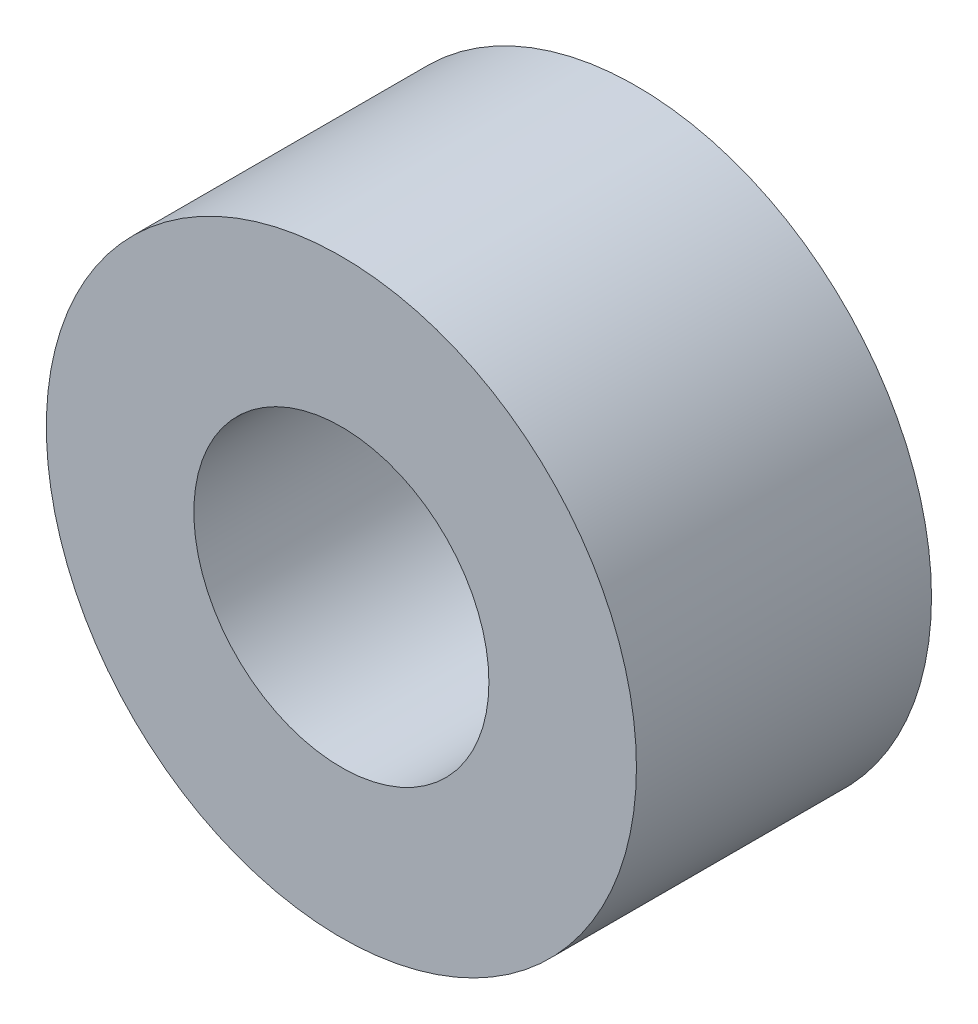
ISO-10303-21;
HEADER;
FILE_DESCRIPTION(('STEP AP214'),'2;1');
FILE_NAME('part.step','',(''),(''),'','','');
FILE_SCHEMA(('AUTOMOTIVE_DESIGN { 1 0 10303 214 1 1 1 1 }'));
ENDSEC;
DATA;
#1=APPLICATION_CONTEXT('core data for automotive mechanical design processes');
#2=APPLICATION_PROTOCOL_DEFINITION('international standard','automotive_design',2000,#1);
#3=PRODUCT_CONTEXT('',#1,'mechanical');
#4=PRODUCT('Part','Part','',(#3));
#5=PRODUCT_RELATED_PRODUCT_CATEGORY('part','',(#4));
#6=PRODUCT_DEFINITION_FORMATION('','',#4);
#7=PRODUCT_DEFINITION_CONTEXT('part definition',#1,'design');
#8=PRODUCT_DEFINITION('design','',#6,#7);
#9=PRODUCT_DEFINITION_SHAPE('','',#8);
#10=(LENGTH_UNIT() NAMED_UNIT(*) SI_UNIT(.MILLI.,.METRE.));
#11=(NAMED_UNIT(*) PLANE_ANGLE_UNIT() SI_UNIT($,.RADIAN.));
#12=(NAMED_UNIT(*) SI_UNIT($,.STERADIAN.) SOLID_ANGLE_UNIT());
#13=UNCERTAINTY_MEASURE_WITH_UNIT(LENGTH_MEASURE(1.E-05),#10,'distance_accuracy_value','');
#14=(GEOMETRIC_REPRESENTATION_CONTEXT(3) GLOBAL_UNCERTAINTY_ASSIGNED_CONTEXT((#13)) GLOBAL_UNIT_ASSIGNED_CONTEXT((#10,
#11,#12)) REPRESENTATION_CONTEXT('',''));
#15=CARTESIAN_POINT('',(0.,0.,0.));
#16=DIRECTION('',(0.,0.,1.));
#17=DIRECTION('',(1.,0.,0.));
#18=AXIS2_PLACEMENT_3D('',#15,#16,#17);
#19=CARTESIAN_POINT('',(0.,0.,6.));
#20=DIRECTION('',(0.,0.,1.));
#21=DIRECTION('',(1.,0.,0.));
#22=AXIS2_PLACEMENT_3D('',#19,#20,#21);
#23=PLANE('',#22);
#24=CARTESIAN_POINT('',(0.,0.,6.));
#25=DIRECTION('',(0.,0.,1.));
#26=DIRECTION('',(1.,0.,0.));
#27=AXIS2_PLACEMENT_3D('',#24,#25,#26);
#28=CIRCLE('',#27,6.);
#29=CARTESIAN_POINT('',(6.,0.,6.));
#30=VERTEX_POINT('',#29);
#31=EDGE_CURVE('E10',#30,#30,#28,.T.);
#32=ORIENTED_EDGE('',*,*,#31,.T.);
#33=EDGE_LOOP('',(#32));
#34=FACE_BOUND('',#33,.T.);
#35=CARTESIAN_POINT('',(0.,0.,6.));
#36=DIRECTION('',(0.,0.,1.));
#37=DIRECTION('',(1.,0.,0.));
#38=AXIS2_PLACEMENT_3D('',#35,#36,#37);
#39=CIRCLE('',#38,3.);
#40=CARTESIAN_POINT('',(3.,0.,6.));
#41=VERTEX_POINT('',#40);
#42=EDGE_CURVE('E43',#41,#41,#39,.T.);
#43=ORIENTED_EDGE('',*,*,#42,.F.);
#44=EDGE_LOOP('',(#43));
#45=FACE_BOUND('',#44,.T.);
#46=ADVANCED_FACE('F32',(#34,#45),#23,.T.);
#47=CARTESIAN_POINT('',(0.,0.,0.));
#48=DIRECTION('',(0.,0.,1.));
#49=DIRECTION('',(1.,0.,0.));
#50=AXIS2_PLACEMENT_3D('',#47,#48,#49);
#51=PLANE('',#50);
#52=CARTESIAN_POINT('',(0.,0.,0.));
#53=DIRECTION('',(0.,0.,1.));
#54=DIRECTION('',(1.,0.,0.));
#55=AXIS2_PLACEMENT_3D('',#52,#53,#54);
#56=CIRCLE('',#55,6.);
#57=CARTESIAN_POINT('',(6.,0.,0.));
#58=VERTEX_POINT('',#57);
#59=EDGE_CURVE('E36',#58,#58,#56,.T.);
#60=ORIENTED_EDGE('',*,*,#59,.F.);
#61=EDGE_LOOP('',(#60));
#62=FACE_BOUND('',#61,.T.);
#63=CARTESIAN_POINT('',(0.,0.,0.));
#64=DIRECTION('',(0.,0.,1.));
#65=DIRECTION('',(1.,0.,0.));
#66=AXIS2_PLACEMENT_3D('',#63,#64,#65);
#67=CIRCLE('',#66,3.);
#68=CARTESIAN_POINT('',(3.,0.,0.));
#69=VERTEX_POINT('',#68);
#70=EDGE_CURVE('E45',#69,#69,#67,.T.);
#71=ORIENTED_EDGE('',*,*,#70,.T.);
#72=EDGE_LOOP('',(#71));
#73=FACE_BOUND('',#72,.T.);
#74=ADVANCED_FACE('F55',(#62,#73),#51,.F.);
#75=CARTESIAN_POINT('',(0.,0.,6.));
#76=DIRECTION('',(0.,0.,-1.));
#77=DIRECTION('',(-1.,0.,0.));
#78=AXIS2_PLACEMENT_3D('',#75,#76,#77);
#79=CYLINDRICAL_SURFACE('',#78,6.);
#80=ORIENTED_EDGE('',*,*,#31,.F.);
#81=EDGE_LOOP('',(#80));
#82=FACE_BOUND('',#81,.T.);
#83=ORIENTED_EDGE('',*,*,#59,.T.);
#84=EDGE_LOOP('',(#83));
#85=FACE_BOUND('',#84,.T.);
#86=ADVANCED_FACE('F34',(#82,#85),#79,.T.);
#87=CARTESIAN_POINT('',(0.,0.,6.));
#88=DIRECTION('',(0.,0.,-1.));
#89=DIRECTION('',(-1.,0.,0.));
#90=AXIS2_PLACEMENT_3D('',#87,#88,#89);
#91=CYLINDRICAL_SURFACE('',#90,3.);
#92=ORIENTED_EDGE('',*,*,#42,.T.);
#93=EDGE_LOOP('',(#92));
#94=FACE_BOUND('',#93,.T.);
#95=ORIENTED_EDGE('',*,*,#70,.F.);
#96=EDGE_LOOP('',(#95));
#97=FACE_BOUND('',#96,.T.);
#98=ADVANCED_FACE('F51',(#94,#97),#91,.F.);
#99=CLOSED_SHELL('',(#46,#74,#86,#98));
#100=MANIFOLD_SOLID_BREP('B2',#99);
#101=ADVANCED_BREP_SHAPE_REPRESENTATION('',(#18,#100),#14);
#102=SHAPE_DEFINITION_REPRESENTATION(#9,#101);
ENDSEC;
END-ISO-10303-21;
